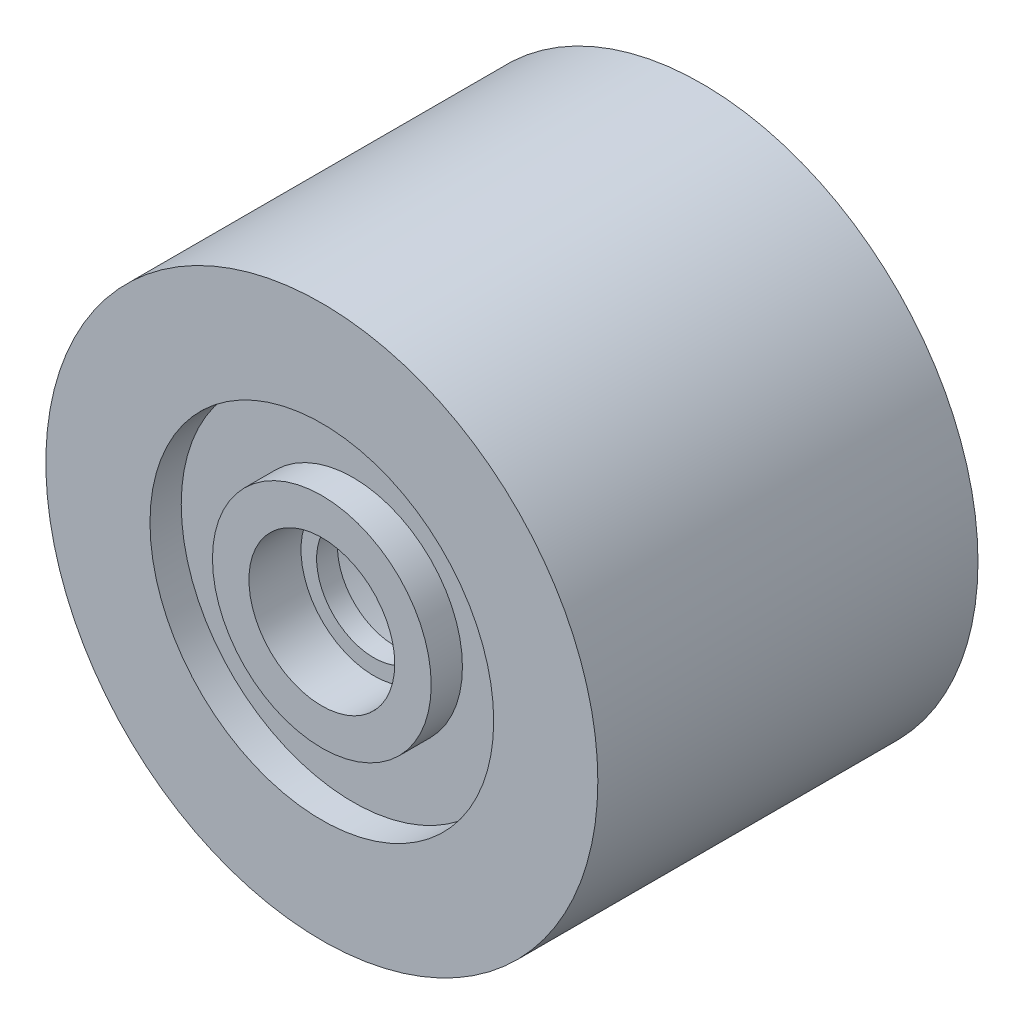
ISO-10303-21;
HEADER;
FILE_DESCRIPTION(('STEP AP214'),'2;1');
FILE_NAME('part.step','',(''),(''),'','','');
FILE_SCHEMA(('AUTOMOTIVE_DESIGN { 1 0 10303 214 1 1 1 1 }'));
ENDSEC;
DATA;
#1=APPLICATION_CONTEXT('core data for automotive mechanical design processes');
#2=APPLICATION_PROTOCOL_DEFINITION('international standard','automotive_design',2000,#1);
#3=PRODUCT_CONTEXT('',#1,'mechanical');
#4=PRODUCT('Part','Part','',(#3));
#5=PRODUCT_RELATED_PRODUCT_CATEGORY('part','',(#4));
#6=PRODUCT_DEFINITION_FORMATION('','',#4);
#7=PRODUCT_DEFINITION_CONTEXT('part definition',#1,'design');
#8=PRODUCT_DEFINITION('design','',#6,#7);
#9=PRODUCT_DEFINITION_SHAPE('','',#8);
#10=(LENGTH_UNIT() NAMED_UNIT(*) SI_UNIT(.MILLI.,.METRE.));
#11=(NAMED_UNIT(*) PLANE_ANGLE_UNIT() SI_UNIT($,.RADIAN.));
#12=(NAMED_UNIT(*) SI_UNIT($,.STERADIAN.) SOLID_ANGLE_UNIT());
#13=UNCERTAINTY_MEASURE_WITH_UNIT(LENGTH_MEASURE(1.E-05),#10,'distance_accuracy_value','');
#14=(GEOMETRIC_REPRESENTATION_CONTEXT(3) GLOBAL_UNCERTAINTY_ASSIGNED_CONTEXT((#13)) GLOBAL_UNIT_ASSIGNED_CONTEXT((#10,
#11,#12)) REPRESENTATION_CONTEXT('',''));
#15=CARTESIAN_POINT('',(0.,0.,0.));
#16=DIRECTION('',(0.,0.,1.));
#17=DIRECTION('',(1.,0.,0.));
#18=AXIS2_PLACEMENT_3D('',#15,#16,#17);
#19=CARTESIAN_POINT('',(0.,0.,10.123));
#20=DIRECTION('',(0.,0.,1.));
#21=DIRECTION('',(1.,0.,0.));
#22=AXIS2_PLACEMENT_3D('',#19,#20,#21);
#23=CYLINDRICAL_SURFACE('',#22,20.);
#24=CARTESIAN_POINT('',(0.,0.,-10.7));
#25=DIRECTION('',(0.,0.,1.));
#26=DIRECTION('',(1.,0.,0.));
#27=AXIS2_PLACEMENT_3D('',#24,#25,#26);
#28=CIRCLE('',#27,20.);
#29=CARTESIAN_POINT('',(20.,0.,-10.7));
#30=VERTEX_POINT('',#29);
#31=EDGE_CURVE('E77',#30,#30,#28,.T.);
#32=ORIENTED_EDGE('',*,*,#31,.T.);
#33=EDGE_LOOP('',(#32));
#34=FACE_BOUND('',#33,.T.);
#35=CARTESIAN_POINT('',(0.,0.,-40.2));
#36=DIRECTION('',(0.,0.,1.));
#37=DIRECTION('',(1.,0.,0.));
#38=AXIS2_PLACEMENT_3D('',#35,#36,#37);
#39=CIRCLE('',#38,20.);
#40=CARTESIAN_POINT('',(20.,0.,-40.2));
#41=VERTEX_POINT('',#40);
#42=EDGE_CURVE('E10',#41,#41,#39,.T.);
#43=ORIENTED_EDGE('',*,*,#42,.F.);
#44=EDGE_LOOP('',(#43));
#45=FACE_BOUND('',#44,.T.);
#46=ADVANCED_FACE('F37',(#34,#45),#23,.F.);
#47=CARTESIAN_POINT('',(20.,0.,-40.2));
#48=DIRECTION('',(0.,0.,-1.));
#49=DIRECTION('',(-1.,0.,0.));
#50=AXIS2_PLACEMENT_3D('',#47,#48,#49);
#51=PLANE('',#50);
#52=CARTESIAN_POINT('',(1.6985546288162E-13,-23.5,-40.2));
#53=DIRECTION('',(0.,0.,1.));
#54=DIRECTION('',(0.,1.,0.));
#55=AXIS2_PLACEMENT_3D('',#52,#53,#54);
#56=CIRCLE('',#55,1.05);
#57=CARTESIAN_POINT('',(1.66189407475835E-13,-22.45,-40.2));
#58=VERTEX_POINT('',#57);
#59=EDGE_CURVE('E99',#58,#58,#56,.T.);
#60=ORIENTED_EDGE('',*,*,#59,.T.);
#61=EDGE_LOOP('',(#60));
#62=FACE_BOUND('',#61,.T.);
#63=CARTESIAN_POINT('',(23.5,0.,-40.2));
#64=DIRECTION('',(0.,0.,1.));
#65=DIRECTION('',(-1.,0.,0.));
#66=AXIS2_PLACEMENT_3D('',#63,#64,#65);
#67=CIRCLE('',#66,1.05);
#68=CARTESIAN_POINT('',(22.45,0.,-40.2));
#69=VERTEX_POINT('',#68);
#70=EDGE_CURVE('E93',#69,#69,#67,.T.);
#71=ORIENTED_EDGE('',*,*,#70,.T.);
#72=EDGE_LOOP('',(#71));
#73=FACE_BOUND('',#72,.T.);
#74=CARTESIAN_POINT('',(-3.33955085807247E-13,23.5,-40.2));
#75=DIRECTION('',(0.,0.,1.));
#76=DIRECTION('',(0.,-1.,0.));
#77=AXIS2_PLACEMENT_3D('',#74,#75,#76);
#78=CIRCLE('',#77,1.05);
#79=CARTESIAN_POINT('',(-3.22956919589891E-13,22.45,-40.2));
#80=VERTEX_POINT('',#79);
#81=EDGE_CURVE('E87',#80,#80,#78,.T.);
#82=ORIENTED_EDGE('',*,*,#81,.T.);
#83=EDGE_LOOP('',(#82));
#84=FACE_BOUND('',#83,.T.);
#85=CARTESIAN_POINT('',(-23.5,0.,-40.2));
#86=DIRECTION('',(0.,0.,1.));
#87=DIRECTION('',(1.,0.,0.));
#88=AXIS2_PLACEMENT_3D('',#85,#86,#87);
#89=CIRCLE('',#88,1.05);
#90=CARTESIAN_POINT('',(-22.45,0.,-40.2));
#91=VERTEX_POINT('',#90);
#92=EDGE_CURVE('E81',#91,#91,#89,.T.);
#93=ORIENTED_EDGE('',*,*,#92,.T.);
#94=EDGE_LOOP('',(#93));
#95=FACE_BOUND('',#94,.T.);
#96=ORIENTED_EDGE('',*,*,#42,.T.);
#97=EDGE_LOOP('',(#96));
#98=FACE_BOUND('',#97,.T.);
#99=CARTESIAN_POINT('',(0.,0.,-40.2));
#100=DIRECTION('',(0.,0.,1.));
#101=DIRECTION('',(1.,0.,0.));
#102=AXIS2_PLACEMENT_3D('',#99,#100,#101);
#103=CIRCLE('',#102,26.5);
#104=CARTESIAN_POINT('',(26.5,0.,-40.2));
#105=VERTEX_POINT('',#104);
#106=EDGE_CURVE('E43',#105,#105,#103,.T.);
#107=ORIENTED_EDGE('',*,*,#106,.F.);
#108=EDGE_LOOP('',(#107));
#109=FACE_BOUND('',#108,.T.);
#110=ADVANCED_FACE('F117',(#62,#73,#84,#95,#98,#109),#51,.T.);
#111=CARTESIAN_POINT('',(0.,0.,10.123));
#112=DIRECTION('',(0.,0.,1.));
#113=DIRECTION('',(1.,0.,0.));
#114=AXIS2_PLACEMENT_3D('',#111,#112,#113);
#115=CYLINDRICAL_SURFACE('',#114,26.5);
#116=ORIENTED_EDGE('',*,*,#106,.T.);
#117=EDGE_LOOP('',(#116));
#118=FACE_BOUND('',#117,.T.);
#119=CARTESIAN_POINT('',(0.,0.,-3.7));
#120=DIRECTION('',(0.,0.,1.));
#121=DIRECTION('',(1.,0.,0.));
#122=AXIS2_PLACEMENT_3D('',#119,#120,#121);
#123=CIRCLE('',#122,26.5);
#124=CARTESIAN_POINT('',(26.5,0.,-3.7));
#125=VERTEX_POINT('',#124);
#126=EDGE_CURVE('E47',#125,#125,#123,.T.);
#127=ORIENTED_EDGE('',*,*,#126,.F.);
#128=EDGE_LOOP('',(#127));
#129=FACE_BOUND('',#128,.T.);
#130=ADVANCED_FACE('F122',(#118,#129),#115,.T.);
#131=CARTESIAN_POINT('',(26.5,0.,-3.7));
#132=DIRECTION('',(0.,0.,1.));
#133=DIRECTION('',(1.,0.,0.));
#134=AXIS2_PLACEMENT_3D('',#131,#132,#133);
#135=PLANE('',#134);
#136=ORIENTED_EDGE('',*,*,#126,.T.);
#137=EDGE_LOOP('',(#136));
#138=FACE_BOUND('',#137,.T.);
#139=CARTESIAN_POINT('',(0.,0.,-3.7));
#140=DIRECTION('',(0.,0.,1.));
#141=DIRECTION('',(1.,0.,0.));
#142=AXIS2_PLACEMENT_3D('',#139,#140,#141);
#143=CIRCLE('',#142,16.5);
#144=CARTESIAN_POINT('',(16.5,0.,-3.7));
#145=VERTEX_POINT('',#144);
#146=EDGE_CURVE('E51',#145,#145,#143,.T.);
#147=ORIENTED_EDGE('',*,*,#146,.F.);
#148=EDGE_LOOP('',(#147));
#149=FACE_BOUND('',#148,.T.);
#150=ADVANCED_FACE('F167',(#138,#149),#135,.T.);
#151=CARTESIAN_POINT('',(0.,0.,10.123));
#152=DIRECTION('',(0.,0.,1.));
#153=DIRECTION('',(1.,0.,0.));
#154=AXIS2_PLACEMENT_3D('',#151,#152,#153);
#155=CYLINDRICAL_SURFACE('',#154,16.5);
#156=ORIENTED_EDGE('',*,*,#146,.T.);
#157=EDGE_LOOP('',(#156));
#158=FACE_BOUND('',#157,.T.);
#159=CARTESIAN_POINT('',(0.,0.,-6.7));
#160=DIRECTION('',(0.,0.,1.));
#161=DIRECTION('',(1.,0.,0.));
#162=AXIS2_PLACEMENT_3D('',#159,#160,#161);
#163=CIRCLE('',#162,16.5);
#164=CARTESIAN_POINT('',(16.5,0.,-6.7));
#165=VERTEX_POINT('',#164);
#166=EDGE_CURVE('E56',#165,#165,#163,.T.);
#167=ORIENTED_EDGE('',*,*,#166,.F.);
#168=EDGE_LOOP('',(#167));
#169=FACE_BOUND('',#168,.T.);
#170=ADVANCED_FACE('F163',(#158,#169),#155,.F.);
#171=CARTESIAN_POINT('',(16.5,0.,-6.7));
#172=DIRECTION('',(0.,0.,1.));
#173=DIRECTION('',(1.,0.,0.));
#174=AXIS2_PLACEMENT_3D('',#171,#172,#173);
#175=PLANE('',#174);
#176=ORIENTED_EDGE('',*,*,#166,.T.);
#177=EDGE_LOOP('',(#176));
#178=FACE_BOUND('',#177,.T.);
#179=CARTESIAN_POINT('',(0.,0.,-6.7));
#180=DIRECTION('',(0.,0.,1.));
#181=DIRECTION('',(1.,0.,0.));
#182=AXIS2_PLACEMENT_3D('',#179,#180,#181);
#183=CIRCLE('',#182,10.5);
#184=CARTESIAN_POINT('',(10.5,0.,-6.7));
#185=VERTEX_POINT('',#184);
#186=EDGE_CURVE('E59',#185,#185,#183,.T.);
#187=ORIENTED_EDGE('',*,*,#186,.F.);
#188=EDGE_LOOP('',(#187));
#189=FACE_BOUND('',#188,.T.);
#190=ADVANCED_FACE('F159',(#178,#189),#175,.T.);
#191=CARTESIAN_POINT('',(0.,0.,10.123));
#192=DIRECTION('',(0.,0.,1.));
#193=DIRECTION('',(1.,0.,0.));
#194=AXIS2_PLACEMENT_3D('',#191,#192,#193);
#195=CYLINDRICAL_SURFACE('',#194,10.5);
#196=ORIENTED_EDGE('',*,*,#186,.T.);
#197=EDGE_LOOP('',(#196));
#198=FACE_BOUND('',#197,.T.);
#199=CARTESIAN_POINT('',(0.,0.,-3.7));
#200=DIRECTION('',(0.,0.,1.));
#201=DIRECTION('',(1.,0.,0.));
#202=AXIS2_PLACEMENT_3D('',#199,#200,#201);
#203=CIRCLE('',#202,10.5);
#204=CARTESIAN_POINT('',(10.5,0.,-3.7));
#205=VERTEX_POINT('',#204);
#206=EDGE_CURVE('E62',#205,#205,#203,.T.);
#207=ORIENTED_EDGE('',*,*,#206,.F.);
#208=EDGE_LOOP('',(#207));
#209=FACE_BOUND('',#208,.T.);
#210=ADVANCED_FACE('F155',(#198,#209),#195,.T.);
#211=CARTESIAN_POINT('',(10.5,0.,-3.7));
#212=DIRECTION('',(0.,0.,1.));
#213=DIRECTION('',(1.,0.,0.));
#214=AXIS2_PLACEMENT_3D('',#211,#212,#213);
#215=PLANE('',#214);
#216=ORIENTED_EDGE('',*,*,#206,.T.);
#217=EDGE_LOOP('',(#216));
#218=FACE_BOUND('',#217,.T.);
#219=CARTESIAN_POINT('',(0.,0.,-3.7));
#220=DIRECTION('',(0.,0.,1.));
#221=DIRECTION('',(1.,0.,0.));
#222=AXIS2_PLACEMENT_3D('',#219,#220,#221);
#223=CIRCLE('',#222,7.);
#224=CARTESIAN_POINT('',(7.,0.,-3.7));
#225=VERTEX_POINT('',#224);
#226=EDGE_CURVE('E65',#225,#225,#223,.T.);
#227=ORIENTED_EDGE('',*,*,#226,.F.);
#228=EDGE_LOOP('',(#227));
#229=FACE_BOUND('',#228,.T.);
#230=ADVANCED_FACE('F151',(#218,#229),#215,.T.);
#231=CARTESIAN_POINT('',(0.,0.,10.123));
#232=DIRECTION('',(0.,0.,1.));
#233=DIRECTION('',(1.,0.,0.));
#234=AXIS2_PLACEMENT_3D('',#231,#232,#233);
#235=CYLINDRICAL_SURFACE('',#234,7.);
#236=ORIENTED_EDGE('',*,*,#226,.T.);
#237=EDGE_LOOP('',(#236));
#238=FACE_BOUND('',#237,.T.);
#239=CARTESIAN_POINT('',(0.,0.,-8.7));
#240=DIRECTION('',(0.,0.,1.));
#241=DIRECTION('',(1.,0.,0.));
#242=AXIS2_PLACEMENT_3D('',#239,#240,#241);
#243=CIRCLE('',#242,7.);
#244=CARTESIAN_POINT('',(7.,0.,-8.7));
#245=VERTEX_POINT('',#244);
#246=EDGE_CURVE('E68',#245,#245,#243,.T.);
#247=ORIENTED_EDGE('',*,*,#246,.F.);
#248=EDGE_LOOP('',(#247));
#249=FACE_BOUND('',#248,.T.);
#250=ADVANCED_FACE('F147',(#238,#249),#235,.F.);
#251=CARTESIAN_POINT('',(7.,0.,-8.7));
#252=DIRECTION('',(0.,0.,1.));
#253=DIRECTION('',(1.,0.,0.));
#254=AXIS2_PLACEMENT_3D('',#251,#252,#253);
#255=PLANE('',#254);
#256=ORIENTED_EDGE('',*,*,#246,.T.);
#257=EDGE_LOOP('',(#256));
#258=FACE_BOUND('',#257,.T.);
#259=CARTESIAN_POINT('',(0.,0.,-8.7));
#260=DIRECTION('',(0.,0.,1.));
#261=DIRECTION('',(1.,0.,0.));
#262=AXIS2_PLACEMENT_3D('',#259,#260,#261);
#263=CIRCLE('',#262,5.5);
#264=CARTESIAN_POINT('',(5.5,0.,-8.7));
#265=VERTEX_POINT('',#264);
#266=EDGE_CURVE('E71',#265,#265,#263,.T.);
#267=ORIENTED_EDGE('',*,*,#266,.F.);
#268=EDGE_LOOP('',(#267));
#269=FACE_BOUND('',#268,.T.);
#270=ADVANCED_FACE('F140',(#258,#269),#255,.T.);
#271=CARTESIAN_POINT('',(0.,0.,10.123));
#272=DIRECTION('',(0.,0.,1.));
#273=DIRECTION('',(1.,0.,0.));
#274=AXIS2_PLACEMENT_3D('',#271,#272,#273);
#275=CYLINDRICAL_SURFACE('',#274,5.5);
#276=ORIENTED_EDGE('',*,*,#266,.T.);
#277=EDGE_LOOP('',(#276));
#278=FACE_BOUND('',#277,.T.);
#279=CARTESIAN_POINT('',(0.,0.,-10.7));
#280=DIRECTION('',(0.,0.,1.));
#281=DIRECTION('',(1.,0.,0.));
#282=AXIS2_PLACEMENT_3D('',#279,#280,#281);
#283=CIRCLE('',#282,5.5);
#284=CARTESIAN_POINT('',(5.5,0.,-10.7));
#285=VERTEX_POINT('',#284);
#286=EDGE_CURVE('E74',#285,#285,#283,.T.);
#287=ORIENTED_EDGE('',*,*,#286,.F.);
#288=EDGE_LOOP('',(#287));
#289=FACE_BOUND('',#288,.T.);
#290=ADVANCED_FACE('F130',(#278,#289),#275,.F.);
#291=CARTESIAN_POINT('',(5.5,0.,-10.7));
#292=DIRECTION('',(0.,0.,-1.));
#293=DIRECTION('',(-1.,0.,0.));
#294=AXIS2_PLACEMENT_3D('',#291,#292,#293);
#295=PLANE('',#294);
#296=ORIENTED_EDGE('',*,*,#286,.T.);
#297=EDGE_LOOP('',(#296));
#298=FACE_BOUND('',#297,.T.);
#299=ORIENTED_EDGE('',*,*,#31,.F.);
#300=EDGE_LOOP('',(#299));
#301=FACE_BOUND('',#300,.T.);
#302=ADVANCED_FACE('F127',(#298,#301),#295,.T.);
#303=CARTESIAN_POINT('',(-23.5,0.,-32.2));
#304=DIRECTION('',(0.,0.,-1.));
#305=DIRECTION('',(-1.,0.,0.));
#306=AXIS2_PLACEMENT_3D('',#303,#304,#305);
#307=CYLINDRICAL_SURFACE('',#306,1.05);
#308=CARTESIAN_POINT('',(-23.5,0.,-32.2));
#309=DIRECTION('',(0.,0.,1.));
#310=DIRECTION('',(1.,0.,0.));
#311=AXIS2_PLACEMENT_3D('',#308,#309,#310);
#312=CIRCLE('',#311,1.05);
#313=CARTESIAN_POINT('',(-22.45,0.,-32.2));
#314=VERTEX_POINT('',#313);
#315=EDGE_CURVE('E80',#314,#314,#312,.T.);
#316=ORIENTED_EDGE('',*,*,#315,.T.);
#317=EDGE_LOOP('',(#316));
#318=FACE_BOUND('',#317,.T.);
#319=ORIENTED_EDGE('',*,*,#92,.F.);
#320=EDGE_LOOP('',(#319));
#321=FACE_BOUND('',#320,.T.);
#322=ADVANCED_FACE('F129',(#318,#321),#307,.F.);
#323=CARTESIAN_POINT('',(-23.5,0.,-32.2));
#324=DIRECTION('',(0.,0.,1.));
#325=DIRECTION('',(1.,0.,0.));
#326=AXIS2_PLACEMENT_3D('',#323,#324,#325);
#327=PLANE('',#326);
#328=ORIENTED_EDGE('',*,*,#315,.F.);
#329=EDGE_LOOP('',(#328));
#330=FACE_BOUND('',#329,.T.);
#331=ADVANCED_FACE('F137',(#330),#327,.F.);
#332=CARTESIAN_POINT('',(-3.33955085807247E-13,23.5,-32.2));
#333=DIRECTION('',(0.,0.,-1.));
#334=DIRECTION('',(-1.,0.,0.));
#335=AXIS2_PLACEMENT_3D('',#332,#333,#334);
#336=CYLINDRICAL_SURFACE('',#335,1.05);
#337=CARTESIAN_POINT('',(-3.33955085807247E-13,23.5,-32.2));
#338=DIRECTION('',(0.,0.,1.));
#339=DIRECTION('',(0.,-1.,0.));
#340=AXIS2_PLACEMENT_3D('',#337,#338,#339);
#341=CIRCLE('',#340,1.05);
#342=CARTESIAN_POINT('',(-3.22956919589891E-13,22.45,-32.2));
#343=VERTEX_POINT('',#342);
#344=EDGE_CURVE('E90',#343,#343,#341,.T.);
#345=ORIENTED_EDGE('',*,*,#344,.T.);
#346=EDGE_LOOP('',(#345));
#347=FACE_BOUND('',#346,.T.);
#348=ORIENTED_EDGE('',*,*,#81,.F.);
#349=EDGE_LOOP('',(#348));
#350=FACE_BOUND('',#349,.T.);
#351=ADVANCED_FACE('F248',(#347,#350),#336,.F.);
#352=CARTESIAN_POINT('',(-3.33955085807247E-13,23.5,-32.2));
#353=DIRECTION('',(0.,0.,1.));
#354=DIRECTION('',(0.,-1.,0.));
#355=AXIS2_PLACEMENT_3D('',#352,#353,#354);
#356=PLANE('',#355);
#357=ORIENTED_EDGE('',*,*,#344,.F.);
#358=EDGE_LOOP('',(#357));
#359=FACE_BOUND('',#358,.T.);
#360=ADVANCED_FACE('F265',(#359),#356,.F.);
#361=CARTESIAN_POINT('',(23.5,0.,-32.2));
#362=DIRECTION('',(0.,0.,-1.));
#363=DIRECTION('',(-1.,0.,0.));
#364=AXIS2_PLACEMENT_3D('',#361,#362,#363);
#365=CYLINDRICAL_SURFACE('',#364,1.05);
#366=CARTESIAN_POINT('',(23.5,0.,-32.2));
#367=DIRECTION('',(0.,0.,1.));
#368=DIRECTION('',(-1.,0.,0.));
#369=AXIS2_PLACEMENT_3D('',#366,#367,#368);
#370=CIRCLE('',#369,1.05);
#371=CARTESIAN_POINT('',(22.45,0.,-32.2));
#372=VERTEX_POINT('',#371);
#373=EDGE_CURVE('E96',#372,#372,#370,.T.);
#374=ORIENTED_EDGE('',*,*,#373,.T.);
#375=EDGE_LOOP('',(#374));
#376=FACE_BOUND('',#375,.T.);
#377=ORIENTED_EDGE('',*,*,#70,.F.);
#378=EDGE_LOOP('',(#377));
#379=FACE_BOUND('',#378,.T.);
#380=ADVANCED_FACE('F276',(#376,#379),#365,.F.);
#381=CARTESIAN_POINT('',(23.5,0.,-32.2));
#382=DIRECTION('',(0.,0.,1.));
#383=DIRECTION('',(-1.,0.,0.));
#384=AXIS2_PLACEMENT_3D('',#381,#382,#383);
#385=PLANE('',#384);
#386=ORIENTED_EDGE('',*,*,#373,.F.);
#387=EDGE_LOOP('',(#386));
#388=FACE_BOUND('',#387,.T.);
#389=ADVANCED_FACE('F114',(#388),#385,.F.);
#390=CARTESIAN_POINT('',(1.6985546288162E-13,-23.5,-32.2));
#391=DIRECTION('',(0.,0.,-1.));
#392=DIRECTION('',(-1.,0.,0.));
#393=AXIS2_PLACEMENT_3D('',#390,#391,#392);
#394=CYLINDRICAL_SURFACE('',#393,1.05);
#395=CARTESIAN_POINT('',(1.6985546288162E-13,-23.5,-32.2));
#396=DIRECTION('',(0.,0.,1.));
#397=DIRECTION('',(0.,1.,0.));
#398=AXIS2_PLACEMENT_3D('',#395,#396,#397);
#399=CIRCLE('',#398,1.05);
#400=CARTESIAN_POINT('',(1.66189407475835E-13,-22.45,-32.2));
#401=VERTEX_POINT('',#400);
#402=EDGE_CURVE('E84',#401,#401,#399,.T.);
#403=ORIENTED_EDGE('',*,*,#402,.T.);
#404=EDGE_LOOP('',(#403));
#405=FACE_BOUND('',#404,.T.);
#406=ORIENTED_EDGE('',*,*,#59,.F.);
#407=EDGE_LOOP('',(#406));
#408=FACE_BOUND('',#407,.T.);
#409=ADVANCED_FACE('F105',(#405,#408),#394,.F.);
#410=CARTESIAN_POINT('',(1.6985546288162E-13,-23.5,-32.2));
#411=DIRECTION('',(0.,0.,1.));
#412=DIRECTION('',(0.,1.,0.));
#413=AXIS2_PLACEMENT_3D('',#410,#411,#412);
#414=PLANE('',#413);
#415=ORIENTED_EDGE('',*,*,#402,.F.);
#416=EDGE_LOOP('',(#415));
#417=FACE_BOUND('',#416,.T.);
#418=ADVANCED_FACE('F108',(#417),#414,.F.);
#419=CLOSED_SHELL('',(#46,#110,#130,#150,#170,#190,#210,#230,#250,#270,#290,#302,#322,#331,#351,
#360,#380,#389,#409,#418));
#420=MANIFOLD_SOLID_BREP('B2',#419);
#421=ADVANCED_BREP_SHAPE_REPRESENTATION('',(#18,#420),#14);
#422=SHAPE_DEFINITION_REPRESENTATION(#9,#421);
ENDSEC;
END-ISO-10303-21;
